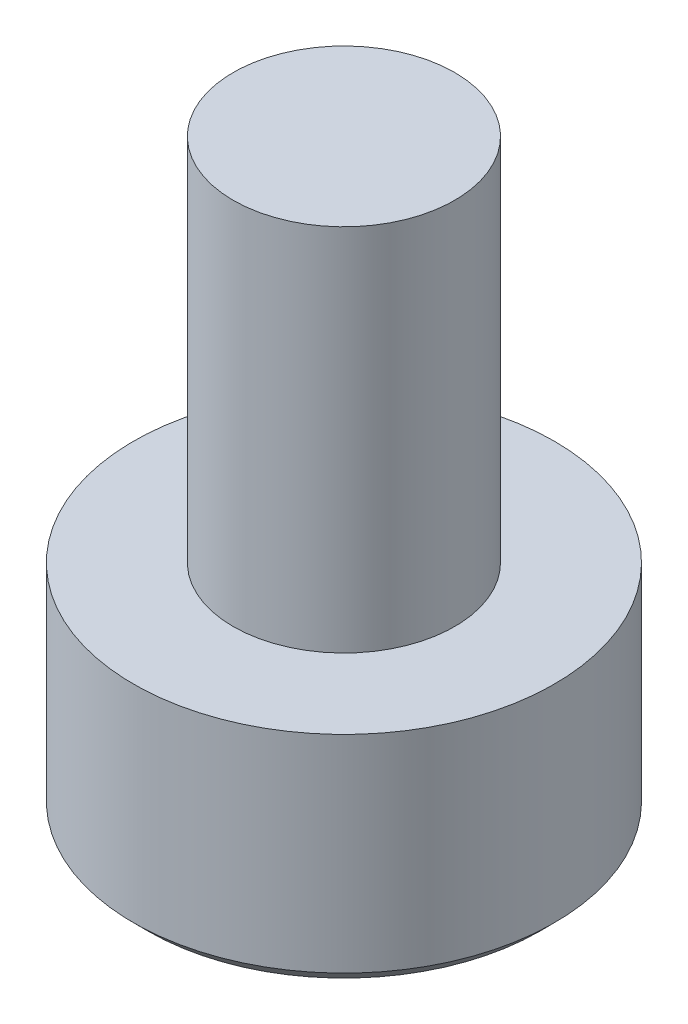
ISO-10303-21;
HEADER;
FILE_DESCRIPTION(('STEP AP214'),'2;1');
FILE_NAME('part.step','',(''),(''),'','','');
FILE_SCHEMA(('AUTOMOTIVE_DESIGN { 1 0 10303 214 1 1 1 1 }'));
ENDSEC;
DATA;
#1=APPLICATION_CONTEXT('core data for automotive mechanical design processes');
#2=APPLICATION_PROTOCOL_DEFINITION('international standard','automotive_design',2000,#1);
#3=PRODUCT_CONTEXT('',#1,'mechanical');
#4=PRODUCT('Part','Part','',(#3));
#5=PRODUCT_RELATED_PRODUCT_CATEGORY('part','',(#4));
#6=PRODUCT_DEFINITION_FORMATION('','',#4);
#7=PRODUCT_DEFINITION_CONTEXT('part definition',#1,'design');
#8=PRODUCT_DEFINITION('design','',#6,#7);
#9=PRODUCT_DEFINITION_SHAPE('','',#8);
#10=(LENGTH_UNIT() NAMED_UNIT(*) SI_UNIT(.MILLI.,.METRE.));
#11=(NAMED_UNIT(*) PLANE_ANGLE_UNIT() SI_UNIT($,.RADIAN.));
#12=(NAMED_UNIT(*) SI_UNIT($,.STERADIAN.) SOLID_ANGLE_UNIT());
#13=UNCERTAINTY_MEASURE_WITH_UNIT(LENGTH_MEASURE(1.E-05),#10,'distance_accuracy_value','');
#14=(GEOMETRIC_REPRESENTATION_CONTEXT(3) GLOBAL_UNCERTAINTY_ASSIGNED_CONTEXT((#13)) GLOBAL_UNIT_ASSIGNED_CONTEXT((#10,
#11,#12)) REPRESENTATION_CONTEXT('',''));
#15=CARTESIAN_POINT('',(0.,0.,0.));
#16=DIRECTION('',(0.,0.,1.));
#17=DIRECTION('',(1.,0.,0.));
#18=AXIS2_PLACEMENT_3D('',#15,#16,#17);
#19=CARTESIAN_POINT('',(0.,5.,0.));
#20=DIRECTION('',(0.,-1.,0.));
#21=DIRECTION('',(0.,0.,-1.));
#22=AXIS2_PLACEMENT_3D('',#19,#20,#21);
#23=CYLINDRICAL_SURFACE('',#22,1.5);
#24=CARTESIAN_POINT('',(0.,5.,0.));
#25=DIRECTION('',(0.,1.,0.));
#26=DIRECTION('',(0.,0.,1.));
#27=AXIS2_PLACEMENT_3D('',#24,#25,#26);
#28=CIRCLE('',#27,1.5);
#29=CARTESIAN_POINT('',(0.,5.,1.5));
#30=VERTEX_POINT('',#29);
#31=EDGE_CURVE('E155',#30,#30,#28,.T.);
#32=ORIENTED_EDGE('',*,*,#31,.F.);
#33=EDGE_LOOP('',(#32));
#34=FACE_BOUND('',#33,.T.);
#35=CARTESIAN_POINT('',(0.,0.,0.));
#36=DIRECTION('',(0.,1.,0.));
#37=DIRECTION('',(0.,0.,1.));
#38=AXIS2_PLACEMENT_3D('',#35,#36,#37);
#39=CIRCLE('',#38,1.5);
#40=CARTESIAN_POINT('',(0.,0.,1.5));
#41=VERTEX_POINT('',#40);
#42=EDGE_CURVE('E154',#41,#41,#39,.T.);
#43=ORIENTED_EDGE('',*,*,#42,.T.);
#44=EDGE_LOOP('',(#43));
#45=FACE_BOUND('',#44,.T.);
#46=ADVANCED_FACE('F43',(#34,#45),#23,.T.);
#47=CARTESIAN_POINT('',(0.,5.,0.));
#48=DIRECTION('',(0.,1.,0.));
#49=DIRECTION('',(0.,0.,1.));
#50=AXIS2_PLACEMENT_3D('',#47,#48,#49);
#51=PLANE('',#50);
#52=ORIENTED_EDGE('',*,*,#31,.T.);
#53=EDGE_LOOP('',(#52));
#54=FACE_BOUND('',#53,.T.);
#55=ADVANCED_FACE('F175',(#54),#51,.T.);
#56=CARTESIAN_POINT('',(0.,-3.,0.));
#57=DIRECTION('',(0.,1.,0.));
#58=DIRECTION('',(0.,0.,1.));
#59=AXIS2_PLACEMENT_3D('',#56,#57,#58);
#60=CYLINDRICAL_SURFACE('',#59,2.85);
#61=CARTESIAN_POINT('',(0.,-2.8,0.));
#62=DIRECTION('',(0.,-1.,0.));
#63=DIRECTION('',(0.,0.,-1.));
#64=AXIS2_PLACEMENT_3D('',#61,#62,#63);
#65=CIRCLE('',#64,2.85);
#66=CARTESIAN_POINT('',(0.,-2.8,-2.85));
#67=VERTEX_POINT('',#66);
#68=EDGE_CURVE('E11',#67,#67,#65,.F.);
#69=ORIENTED_EDGE('',*,*,#68,.T.);
#70=EDGE_LOOP('',(#69));
#71=FACE_BOUND('',#70,.T.);
#72=CARTESIAN_POINT('',(0.,0.,0.));
#73=DIRECTION('',(0.,-1.,0.));
#74=DIRECTION('',(0.,0.,-1.));
#75=AXIS2_PLACEMENT_3D('',#72,#73,#74);
#76=CIRCLE('',#75,2.85);
#77=CARTESIAN_POINT('',(0.,0.,-2.85));
#78=VERTEX_POINT('',#77);
#79=EDGE_CURVE('E146',#78,#78,#76,.T.);
#80=ORIENTED_EDGE('',*,*,#79,.T.);
#81=EDGE_LOOP('',(#80));
#82=FACE_BOUND('',#81,.T.);
#83=ADVANCED_FACE('F180',(#71,#82),#60,.T.);
#84=CARTESIAN_POINT('',(0.,-3.,0.));
#85=DIRECTION('',(0.,-1.,0.));
#86=DIRECTION('',(0.,0.,-1.));
#87=AXIS2_PLACEMENT_3D('',#84,#85,#86);
#88=PLANE('',#87);
#89=CARTESIAN_POINT('',(0.,-3.,0.));
#90=DIRECTION('',(0.,-1.,0.));
#91=DIRECTION('',(0.,0.,-1.));
#92=AXIS2_PLACEMENT_3D('',#89,#90,#91);
#93=CIRCLE('',#92,2.65);
#94=CARTESIAN_POINT('',(0.,-3.,-2.65));
#95=VERTEX_POINT('',#94);
#96=EDGE_CURVE('E52',#95,#95,#93,.T.);
#97=ORIENTED_EDGE('',*,*,#96,.T.);
#98=EDGE_LOOP('',(#97));
#99=FACE_BOUND('',#98,.T.);
#100=DIRECTION('',(0.5,0.,0.866025403784439));
#101=VECTOR('',#100,1.);
#102=CARTESIAN_POINT('',(0.721687836487033,-3.,-1.25));
#103=LINE('',#102,#101);
#104=CARTESIAN_POINT('',(0.721687836487033,-3.,-1.25));
#105=VERTEX_POINT('',#104);
#106=CARTESIAN_POINT('',(1.44337567297406,-3.,0.));
#107=VERTEX_POINT('',#106);
#108=EDGE_CURVE('E59',#105,#107,#103,.T.);
#109=ORIENTED_EDGE('',*,*,#108,.F.);
#110=DIRECTION('',(1.,0.,0.));
#111=VECTOR('',#110,1.);
#112=CARTESIAN_POINT('',(-0.721687836487033,-3.,-1.25));
#113=LINE('',#112,#111);
#114=CARTESIAN_POINT('',(-0.721687836487033,-3.,-1.25));
#115=VERTEX_POINT('',#114);
#116=EDGE_CURVE('E142',#115,#105,#113,.T.);
#117=ORIENTED_EDGE('',*,*,#116,.F.);
#118=DIRECTION('',(0.5,0.,-0.866025403784438));
#119=VECTOR('',#118,1.);
#120=CARTESIAN_POINT('',(-1.44337567297407,-3.,0.));
#121=LINE('',#120,#119);
#122=CARTESIAN_POINT('',(-1.44337567297407,-3.,0.));
#123=VERTEX_POINT('',#122);
#124=EDGE_CURVE('E140',#123,#115,#121,.T.);
#125=ORIENTED_EDGE('',*,*,#124,.F.);
#126=DIRECTION('',(-0.5,0.,-0.866025403784439));
#127=VECTOR('',#126,1.);
#128=CARTESIAN_POINT('',(-0.721687836487033,-3.,1.25));
#129=LINE('',#128,#127);
#130=CARTESIAN_POINT('',(-0.721687836487033,-3.,1.25));
#131=VERTEX_POINT('',#130);
#132=EDGE_CURVE('E107',#131,#123,#129,.T.);
#133=ORIENTED_EDGE('',*,*,#132,.F.);
#134=DIRECTION('',(-1.,0.,0.));
#135=VECTOR('',#134,1.);
#136=CARTESIAN_POINT('',(0.721687836487031,-3.,1.25));
#137=LINE('',#136,#135);
#138=CARTESIAN_POINT('',(0.721687836487031,-3.,1.25));
#139=VERTEX_POINT('',#138);
#140=EDGE_CURVE('E136',#139,#131,#137,.T.);
#141=ORIENTED_EDGE('',*,*,#140,.F.);
#142=DIRECTION('',(-0.5,0.,0.866025403784438));
#143=VECTOR('',#142,1.);
#144=CARTESIAN_POINT('',(1.44337567297406,-3.,0.));
#145=LINE('',#144,#143);
#146=EDGE_CURVE('E133',#107,#139,#145,.T.);
#147=ORIENTED_EDGE('',*,*,#146,.F.);
#148=EDGE_LOOP('',(#109,#117,#125,#133,#141,#147));
#149=FACE_BOUND('',#148,.T.);
#150=ADVANCED_FACE('F162',(#99,#149),#88,.T.);
#151=CARTESIAN_POINT('',(0.,0.,0.));
#152=DIRECTION('',(0.,-1.,0.));
#153=DIRECTION('',(0.,0.,-1.));
#154=AXIS2_PLACEMENT_3D('',#151,#152,#153);
#155=PLANE('',#154);
#156=ORIENTED_EDGE('',*,*,#42,.F.);
#157=EDGE_LOOP('',(#156));
#158=FACE_BOUND('',#157,.T.);
#159=ORIENTED_EDGE('',*,*,#79,.F.);
#160=EDGE_LOOP('',(#159));
#161=FACE_BOUND('',#160,.T.);
#162=ADVANCED_FACE('F189',(#158,#161),#155,.F.);
#163=CARTESIAN_POINT('',(0.721687836487033,-2.,-1.25));
#164=DIRECTION('',(0.866025403784439,0.,-0.5));
#165=DIRECTION('',(-0.5,0.,-0.866025403784439));
#166=AXIS2_PLACEMENT_3D('',#163,#164,#165);
#167=PLANE('',#166);
#168=ORIENTED_EDGE('',*,*,#108,.T.);
#169=DIRECTION('',(0.,-1.,0.));
#170=VECTOR('',#169,1.);
#171=CARTESIAN_POINT('',(1.44337567297406,-2.,0.));
#172=LINE('',#171,#170);
#173=CARTESIAN_POINT('',(1.44337567297406,-2.,0.));
#174=VERTEX_POINT('',#173);
#175=EDGE_CURVE('E89',#174,#107,#172,.T.);
#176=ORIENTED_EDGE('',*,*,#175,.F.);
#177=DIRECTION('',(0.5,0.,0.866025403784439));
#178=VECTOR('',#177,1.);
#179=CARTESIAN_POINT('',(0.721687836487033,-2.,-1.25));
#180=LINE('',#179,#178);
#181=CARTESIAN_POINT('',(0.721687836487033,-2.,-1.25));
#182=VERTEX_POINT('',#181);
#183=EDGE_CURVE('E144',#182,#174,#180,.T.);
#184=ORIENTED_EDGE('',*,*,#183,.F.);
#185=DIRECTION('',(0.,-1.,0.));
#186=VECTOR('',#185,1.);
#187=CARTESIAN_POINT('',(0.721687836487033,-2.,-1.25));
#188=LINE('',#187,#186);
#189=EDGE_CURVE('E67',#182,#105,#188,.T.);
#190=ORIENTED_EDGE('',*,*,#189,.T.);
#191=EDGE_LOOP('',(#168,#176,#184,#190));
#192=FACE_BOUND('',#191,.T.);
#193=ADVANCED_FACE('F192',(#192),#167,.F.);
#194=CARTESIAN_POINT('',(-0.721687836487033,-2.,-1.25));
#195=DIRECTION('',(0.,0.,-1.));
#196=DIRECTION('',(-1.,0.,0.));
#197=AXIS2_PLACEMENT_3D('',#194,#195,#196);
#198=PLANE('',#197);
#199=ORIENTED_EDGE('',*,*,#116,.T.);
#200=ORIENTED_EDGE('',*,*,#189,.F.);
#201=DIRECTION('',(1.,0.,0.));
#202=VECTOR('',#201,1.);
#203=CARTESIAN_POINT('',(-0.721687836487033,-2.,-1.25));
#204=LINE('',#203,#202);
#205=CARTESIAN_POINT('',(-0.721687836487033,-2.,-1.25));
#206=VERTEX_POINT('',#205);
#207=EDGE_CURVE('E119',#206,#182,#204,.T.);
#208=ORIENTED_EDGE('',*,*,#207,.F.);
#209=DIRECTION('',(0.,-1.,0.));
#210=VECTOR('',#209,1.);
#211=CARTESIAN_POINT('',(-0.721687836487033,-2.,-1.25));
#212=LINE('',#211,#210);
#213=EDGE_CURVE('E111',#206,#115,#212,.T.);
#214=ORIENTED_EDGE('',*,*,#213,.T.);
#215=EDGE_LOOP('',(#199,#200,#208,#214));
#216=FACE_BOUND('',#215,.T.);
#217=ADVANCED_FACE('F197',(#216),#198,.F.);
#218=CARTESIAN_POINT('',(-1.44337567297407,-2.,0.));
#219=DIRECTION('',(-0.866025403784438,0.,-0.5));
#220=DIRECTION('',(-0.5,0.,0.866025403784439));
#221=AXIS2_PLACEMENT_3D('',#218,#219,#220);
#222=PLANE('',#221);
#223=ORIENTED_EDGE('',*,*,#124,.T.);
#224=ORIENTED_EDGE('',*,*,#213,.F.);
#225=DIRECTION('',(0.5,0.,-0.866025403784438));
#226=VECTOR('',#225,1.);
#227=CARTESIAN_POINT('',(-1.44337567297407,-2.,0.));
#228=LINE('',#227,#226);
#229=CARTESIAN_POINT('',(-1.44337567297407,-2.,0.));
#230=VERTEX_POINT('',#229);
#231=EDGE_CURVE('E115',#230,#206,#228,.T.);
#232=ORIENTED_EDGE('',*,*,#231,.F.);
#233=DIRECTION('',(0.,-1.,0.));
#234=VECTOR('',#233,1.);
#235=CARTESIAN_POINT('',(-1.44337567297407,-2.,0.));
#236=LINE('',#235,#234);
#237=EDGE_CURVE('E100',#230,#123,#236,.T.);
#238=ORIENTED_EDGE('',*,*,#237,.T.);
#239=EDGE_LOOP('',(#223,#224,#232,#238));
#240=FACE_BOUND('',#239,.T.);
#241=ADVANCED_FACE('F116',(#240),#222,.F.);
#242=CARTESIAN_POINT('',(-0.721687836487033,-2.,1.25));
#243=DIRECTION('',(-0.866025403784439,0.,0.5));
#244=DIRECTION('',(0.5,0.,0.866025403784439));
#245=AXIS2_PLACEMENT_3D('',#242,#243,#244);
#246=PLANE('',#245);
#247=ORIENTED_EDGE('',*,*,#132,.T.);
#248=ORIENTED_EDGE('',*,*,#237,.F.);
#249=DIRECTION('',(-0.5,0.,-0.866025403784439));
#250=VECTOR('',#249,1.);
#251=CARTESIAN_POINT('',(-0.721687836487033,-2.,1.25));
#252=LINE('',#251,#250);
#253=CARTESIAN_POINT('',(-0.721687836487033,-2.,1.25));
#254=VERTEX_POINT('',#253);
#255=EDGE_CURVE('E104',#254,#230,#252,.T.);
#256=ORIENTED_EDGE('',*,*,#255,.F.);
#257=DIRECTION('',(0.,-1.,0.));
#258=VECTOR('',#257,1.);
#259=CARTESIAN_POINT('',(-0.721687836487033,-2.,1.25));
#260=LINE('',#259,#258);
#261=EDGE_CURVE('E112',#254,#131,#260,.T.);
#262=ORIENTED_EDGE('',*,*,#261,.T.);
#263=EDGE_LOOP('',(#247,#248,#256,#262));
#264=FACE_BOUND('',#263,.T.);
#265=ADVANCED_FACE('F102',(#264),#246,.F.);
#266=CARTESIAN_POINT('',(0.721687836487031,-2.,1.25));
#267=DIRECTION('',(0.,0.,1.));
#268=DIRECTION('',(1.,0.,0.));
#269=AXIS2_PLACEMENT_3D('',#266,#267,#268);
#270=PLANE('',#269);
#271=ORIENTED_EDGE('',*,*,#140,.T.);
#272=ORIENTED_EDGE('',*,*,#261,.F.);
#273=DIRECTION('',(-1.,0.,0.));
#274=VECTOR('',#273,1.);
#275=CARTESIAN_POINT('',(0.721687836487031,-2.,1.25));
#276=LINE('',#275,#274);
#277=CARTESIAN_POINT('',(0.721687836487031,-2.,1.25));
#278=VERTEX_POINT('',#277);
#279=EDGE_CURVE('E125',#278,#254,#276,.T.);
#280=ORIENTED_EDGE('',*,*,#279,.F.);
#281=DIRECTION('',(0.,-1.,0.));
#282=VECTOR('',#281,1.);
#283=CARTESIAN_POINT('',(0.721687836487031,-2.,1.25));
#284=LINE('',#283,#282);
#285=EDGE_CURVE('E149',#278,#139,#284,.T.);
#286=ORIENTED_EDGE('',*,*,#285,.T.);
#287=EDGE_LOOP('',(#271,#272,#280,#286));
#288=FACE_BOUND('',#287,.T.);
#289=ADVANCED_FACE('F200',(#288),#270,.F.);
#290=CARTESIAN_POINT('',(1.44337567297406,-2.,0.));
#291=DIRECTION('',(0.866025403784439,0.,0.5));
#292=DIRECTION('',(0.5,0.,-0.866025403784439));
#293=AXIS2_PLACEMENT_3D('',#290,#291,#292);
#294=PLANE('',#293);
#295=ORIENTED_EDGE('',*,*,#146,.T.);
#296=ORIENTED_EDGE('',*,*,#285,.F.);
#297=DIRECTION('',(-0.5,0.,0.866025403784438));
#298=VECTOR('',#297,1.);
#299=CARTESIAN_POINT('',(1.44337567297406,-2.,0.));
#300=LINE('',#299,#298);
#301=EDGE_CURVE('E127',#174,#278,#300,.T.);
#302=ORIENTED_EDGE('',*,*,#301,.F.);
#303=ORIENTED_EDGE('',*,*,#175,.T.);
#304=EDGE_LOOP('',(#295,#296,#302,#303));
#305=FACE_BOUND('',#304,.T.);
#306=ADVANCED_FACE('F171',(#305),#294,.F.);
#307=CARTESIAN_POINT('',(0.,-2.,0.));
#308=DIRECTION('',(0.,-1.,0.));
#309=DIRECTION('',(0.,0.,-1.));
#310=AXIS2_PLACEMENT_3D('',#307,#308,#309);
#311=PLANE('',#310);
#312=ORIENTED_EDGE('',*,*,#183,.T.);
#313=ORIENTED_EDGE('',*,*,#301,.T.);
#314=ORIENTED_EDGE('',*,*,#279,.T.);
#315=ORIENTED_EDGE('',*,*,#255,.T.);
#316=ORIENTED_EDGE('',*,*,#231,.T.);
#317=ORIENTED_EDGE('',*,*,#207,.T.);
#318=EDGE_LOOP('',(#312,#313,#314,#315,#316,#317));
#319=FACE_BOUND('',#318,.T.);
#320=ADVANCED_FACE('F122',(#319),#311,.T.);
#321=CARTESIAN_POINT('',(0.,-3.,0.));
#322=DIRECTION('',(0.,1.,0.));
#323=DIRECTION('',(0.,0.,1.));
#324=AXIS2_PLACEMENT_3D('',#321,#322,#323);
#325=CONICAL_SURFACE('',#324,2.65,0.785398163397441);
#326=ORIENTED_EDGE('',*,*,#68,.F.);
#327=EDGE_LOOP('',(#326));
#328=FACE_BOUND('',#327,.T.);
#329=ORIENTED_EDGE('',*,*,#96,.F.);
#330=EDGE_LOOP('',(#329));
#331=FACE_BOUND('',#330,.T.);
#332=ADVANCED_FACE('F46',(#328,#331),#325,.T.);
#333=CLOSED_SHELL('',(#46,#55,#83,#150,#162,#193,#217,#241,#265,#289,#306,#320,#332));
#334=MANIFOLD_SOLID_BREP('B2',#333);
#335=ADVANCED_BREP_SHAPE_REPRESENTATION('',(#18,#334),#14);
#336=SHAPE_DEFINITION_REPRESENTATION(#9,#335);
ENDSEC;
END-ISO-10303-21;
